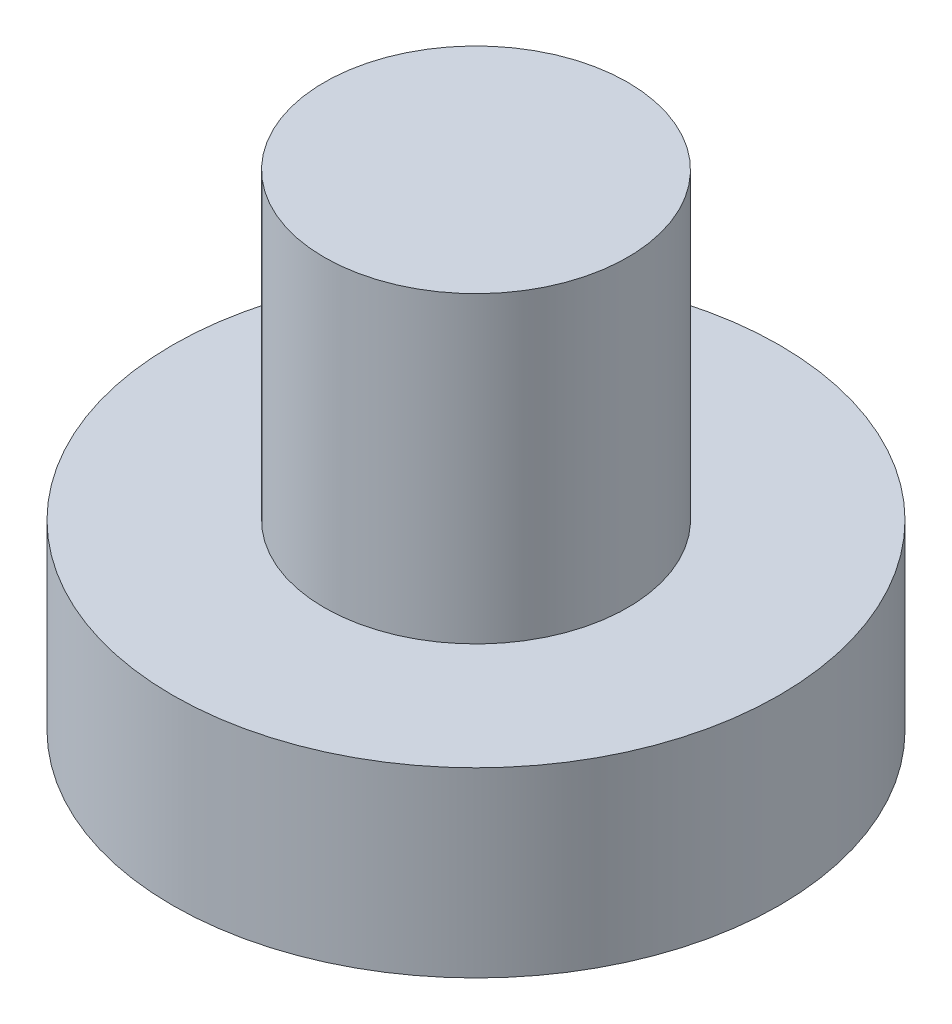
ISO-10303-21;
HEADER;
FILE_DESCRIPTION(('STEP AP214'),'2;1');
FILE_NAME('part.step','',(''),(''),'','','');
FILE_SCHEMA(('AUTOMOTIVE_DESIGN { 1 0 10303 214 1 1 1 1 }'));
ENDSEC;
DATA;
#1=APPLICATION_CONTEXT('core data for automotive mechanical design processes');
#2=APPLICATION_PROTOCOL_DEFINITION('international standard','automotive_design',2000,#1);
#3=PRODUCT_CONTEXT('',#1,'mechanical');
#4=PRODUCT('Part','Part','',(#3));
#5=PRODUCT_RELATED_PRODUCT_CATEGORY('part','',(#4));
#6=PRODUCT_DEFINITION_FORMATION('','',#4);
#7=PRODUCT_DEFINITION_CONTEXT('part definition',#1,'design');
#8=PRODUCT_DEFINITION('design','',#6,#7);
#9=PRODUCT_DEFINITION_SHAPE('','',#8);
#10=(LENGTH_UNIT() NAMED_UNIT(*) SI_UNIT(.MILLI.,.METRE.));
#11=(NAMED_UNIT(*) PLANE_ANGLE_UNIT() SI_UNIT($,.RADIAN.));
#12=(NAMED_UNIT(*) SI_UNIT($,.STERADIAN.) SOLID_ANGLE_UNIT());
#13=UNCERTAINTY_MEASURE_WITH_UNIT(LENGTH_MEASURE(1.E-05),#10,'distance_accuracy_value','');
#14=(GEOMETRIC_REPRESENTATION_CONTEXT(3) GLOBAL_UNCERTAINTY_ASSIGNED_CONTEXT((#13)) GLOBAL_UNIT_ASSIGNED_CONTEXT((#10,
#11,#12)) REPRESENTATION_CONTEXT('',''));
#15=CARTESIAN_POINT('',(0.,0.,0.));
#16=DIRECTION('',(0.,0.,1.));
#17=DIRECTION('',(1.,0.,0.));
#18=AXIS2_PLACEMENT_3D('',#15,#16,#17);
#19=CARTESIAN_POINT('',(0.,30.,0.));
#20=DIRECTION('',(0.,-1.,0.));
#21=DIRECTION('',(0.,0.,-1.));
#22=AXIS2_PLACEMENT_3D('',#19,#20,#21);
#23=CYLINDRICAL_SURFACE('',#22,50.);
#24=CARTESIAN_POINT('',(0.,30.,0.));
#25=DIRECTION('',(0.,1.,0.));
#26=DIRECTION('',(0.,0.,1.));
#27=AXIS2_PLACEMENT_3D('',#24,#25,#26);
#28=CIRCLE('',#27,50.);
#29=CARTESIAN_POINT('',(0.,30.,50.));
#30=VERTEX_POINT('',#29);
#31=EDGE_CURVE('E48',#30,#30,#28,.T.);
#32=ORIENTED_EDGE('',*,*,#31,.F.);
#33=EDGE_LOOP('',(#32));
#34=FACE_BOUND('',#33,.T.);
#35=CARTESIAN_POINT('',(0.,0.,0.));
#36=DIRECTION('',(0.,1.,0.));
#37=DIRECTION('',(0.,0.,1.));
#38=AXIS2_PLACEMENT_3D('',#35,#36,#37);
#39=CIRCLE('',#38,50.);
#40=CARTESIAN_POINT('',(0.,0.,50.));
#41=VERTEX_POINT('',#40);
#42=EDGE_CURVE('E59',#41,#41,#39,.T.);
#43=ORIENTED_EDGE('',*,*,#42,.T.);
#44=EDGE_LOOP('',(#43));
#45=FACE_BOUND('',#44,.T.);
#46=ADVANCED_FACE('F45',(#34,#45),#23,.T.);
#47=CARTESIAN_POINT('',(0.,30.,0.));
#48=DIRECTION('',(0.,1.,0.));
#49=DIRECTION('',(0.,0.,1.));
#50=AXIS2_PLACEMENT_3D('',#47,#48,#49);
#51=PLANE('',#50);
#52=CARTESIAN_POINT('',(0.,30.,0.));
#53=DIRECTION('',(0.,1.,0.));
#54=DIRECTION('',(0.,0.,1.));
#55=AXIS2_PLACEMENT_3D('',#52,#53,#54);
#56=CIRCLE('',#55,25.);
#57=CARTESIAN_POINT('',(0.,30.,25.));
#58=VERTEX_POINT('',#57);
#59=EDGE_CURVE('E12',#58,#58,#56,.T.);
#60=ORIENTED_EDGE('',*,*,#59,.F.);
#61=EDGE_LOOP('',(#60));
#62=FACE_BOUND('',#61,.T.);
#63=ORIENTED_EDGE('',*,*,#31,.T.);
#64=EDGE_LOOP('',(#63));
#65=FACE_BOUND('',#64,.T.);
#66=ADVANCED_FACE('F73',(#62,#65),#51,.T.);
#67=CARTESIAN_POINT('',(0.,0.,0.));
#68=DIRECTION('',(0.,1.,0.));
#69=DIRECTION('',(0.,0.,1.));
#70=AXIS2_PLACEMENT_3D('',#67,#68,#69);
#71=PLANE('',#70);
#72=ORIENTED_EDGE('',*,*,#42,.F.);
#73=EDGE_LOOP('',(#72));
#74=FACE_BOUND('',#73,.T.);
#75=ADVANCED_FACE('F70',(#74),#71,.F.);
#76=CARTESIAN_POINT('',(0.,80.,0.));
#77=DIRECTION('',(0.,-1.,0.));
#78=DIRECTION('',(0.,0.,-1.));
#79=AXIS2_PLACEMENT_3D('',#76,#77,#78);
#80=CYLINDRICAL_SURFACE('',#79,25.);
#81=CARTESIAN_POINT('',(0.,80.,0.));
#82=DIRECTION('',(0.,1.,0.));
#83=DIRECTION('',(0.,0.,1.));
#84=AXIS2_PLACEMENT_3D('',#81,#82,#83);
#85=CIRCLE('',#84,25.);
#86=CARTESIAN_POINT('',(0.,80.,25.));
#87=VERTEX_POINT('',#86);
#88=EDGE_CURVE('E61',#87,#87,#85,.T.);
#89=ORIENTED_EDGE('',*,*,#88,.F.);
#90=EDGE_LOOP('',(#89));
#91=FACE_BOUND('',#90,.T.);
#92=ORIENTED_EDGE('',*,*,#59,.T.);
#93=EDGE_LOOP('',(#92));
#94=FACE_BOUND('',#93,.T.);
#95=ADVANCED_FACE('F72',(#91,#94),#80,.T.);
#96=CARTESIAN_POINT('',(0.,80.,0.));
#97=DIRECTION('',(0.,1.,0.));
#98=DIRECTION('',(0.,0.,1.));
#99=AXIS2_PLACEMENT_3D('',#96,#97,#98);
#100=PLANE('',#99);
#101=ORIENTED_EDGE('',*,*,#88,.T.);
#102=EDGE_LOOP('',(#101));
#103=FACE_BOUND('',#102,.T.);
#104=ADVANCED_FACE('F79',(#103),#100,.T.);
#105=CLOSED_SHELL('',(#46,#66,#75,#95,#104));
#106=MANIFOLD_SOLID_BREP('B2',#105);
#107=ADVANCED_BREP_SHAPE_REPRESENTATION('',(#18,#106),#14);
#108=SHAPE_DEFINITION_REPRESENTATION(#9,#107);
ENDSEC;
END-ISO-10303-21;
